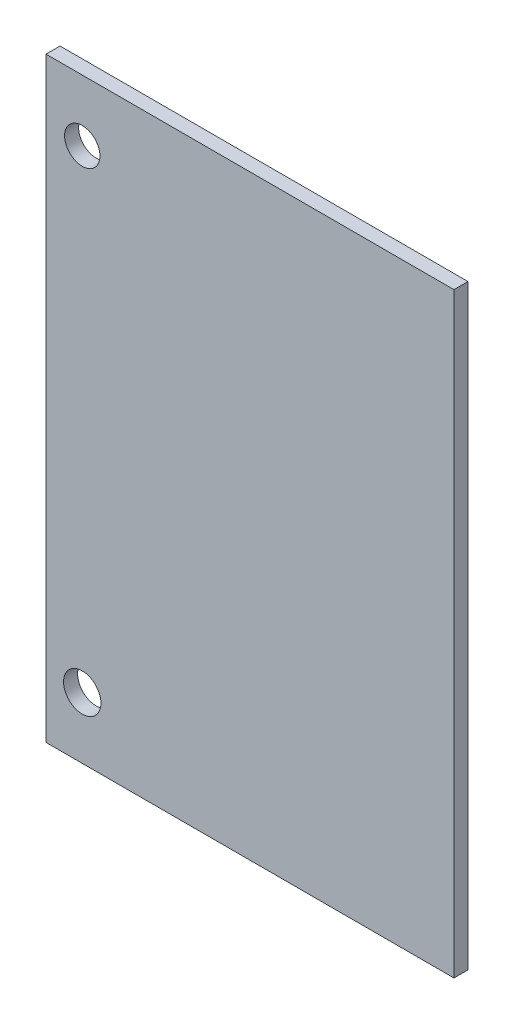
ISO-10303-21;
HEADER;
FILE_DESCRIPTION(('STEP AP214'),'2;1');
FILE_NAME('part.step','',(''),(''),'','','');
FILE_SCHEMA(('AUTOMOTIVE_DESIGN { 1 0 10303 214 1 1 1 1 }'));
ENDSEC;
DATA;
#1=APPLICATION_CONTEXT('core data for automotive mechanical design processes');
#2=APPLICATION_PROTOCOL_DEFINITION('international standard','automotive_design',2000,#1);
#3=PRODUCT_CONTEXT('',#1,'mechanical');
#4=PRODUCT('Part','Part','',(#3));
#5=PRODUCT_RELATED_PRODUCT_CATEGORY('part','',(#4));
#6=PRODUCT_DEFINITION_FORMATION('','',#4);
#7=PRODUCT_DEFINITION_CONTEXT('part definition',#1,'design');
#8=PRODUCT_DEFINITION('design','',#6,#7);
#9=PRODUCT_DEFINITION_SHAPE('','',#8);
#10=(LENGTH_UNIT() NAMED_UNIT(*) SI_UNIT(.MILLI.,.METRE.));
#11=(NAMED_UNIT(*) PLANE_ANGLE_UNIT() SI_UNIT($,.RADIAN.));
#12=(NAMED_UNIT(*) SI_UNIT($,.STERADIAN.) SOLID_ANGLE_UNIT());
#13=UNCERTAINTY_MEASURE_WITH_UNIT(LENGTH_MEASURE(1.E-05),#10,'distance_accuracy_value','');
#14=(GEOMETRIC_REPRESENTATION_CONTEXT(3) GLOBAL_UNCERTAINTY_ASSIGNED_CONTEXT((#13)) GLOBAL_UNIT_ASSIGNED_CONTEXT((#10,
#11,#12)) REPRESENTATION_CONTEXT('',''));
#15=CARTESIAN_POINT('',(0.,0.,0.));
#16=DIRECTION('',(0.,0.,1.));
#17=DIRECTION('',(1.,0.,0.));
#18=AXIS2_PLACEMENT_3D('',#15,#16,#17);
#19=CARTESIAN_POINT('',(0.,0.,1.2));
#20=DIRECTION('',(0.,0.,1.));
#21=DIRECTION('',(1.,0.,0.));
#22=AXIS2_PLACEMENT_3D('',#19,#20,#21);
#23=PLANE('',#22);
#24=DIRECTION('',(0.,-1.,0.));
#25=VECTOR('',#24,1.);
#26=CARTESIAN_POINT('',(-305.123327030624,35.7826153711837,1.2));
#27=LINE('',#26,#25);
#28=CARTESIAN_POINT('',(-305.123327030624,35.7826153711837,1.2));
#29=VERTEX_POINT('',#28);
#30=CARTESIAN_POINT('',(-305.123327030624,-15.2173846288163,1.2));
#31=VERTEX_POINT('',#30);
#32=EDGE_CURVE('E111',#29,#31,#27,.T.);
#33=ORIENTED_EDGE('',*,*,#32,.F.);
#34=DIRECTION('',(-1.,0.,0.));
#35=VECTOR('',#34,1.);
#36=CARTESIAN_POINT('',(-340.023327030624,35.7826153711837,1.2));
#37=LINE('',#36,#35);
#38=CARTESIAN_POINT('',(-340.023327030624,35.7826153711837,1.2));
#39=VERTEX_POINT('',#38);
#40=EDGE_CURVE('E57',#29,#39,#37,.T.);
#41=ORIENTED_EDGE('',*,*,#40,.T.);
#42=DIRECTION('',(0.,-1.,0.));
#43=VECTOR('',#42,1.);
#44=CARTESIAN_POINT('',(-340.023327030624,35.7826153711837,1.2));
#45=LINE('',#44,#43);
#46=CARTESIAN_POINT('',(-340.023327030624,-15.2173846288163,1.2));
#47=VERTEX_POINT('',#46);
#48=EDGE_CURVE('E77',#39,#47,#45,.T.);
#49=ORIENTED_EDGE('',*,*,#48,.T.);
#50=DIRECTION('',(1.,0.,0.));
#51=VECTOR('',#50,1.);
#52=CARTESIAN_POINT('',(-340.023327030624,-15.2173846288163,1.2));
#53=LINE('',#52,#51);
#54=EDGE_CURVE('E95',#47,#31,#53,.T.);
#55=ORIENTED_EDGE('',*,*,#54,.T.);
#56=EDGE_LOOP('',(#33,#41,#49,#55));
#57=FACE_BOUND('',#56,.T.);
#58=CARTESIAN_POINT('',(-336.923327030624,30.5326153711837,1.2));
#59=DIRECTION('',(0.,0.,1.));
#60=DIRECTION('',(1.,0.,0.));
#61=AXIS2_PLACEMENT_3D('',#58,#59,#60);
#62=CIRCLE('',#61,1.51211917062415);
#63=CARTESIAN_POINT('',(-335.411207859999,30.5326153711837,1.2));
#64=VERTEX_POINT('',#63);
#65=EDGE_CURVE('E87',#64,#64,#62,.T.);
#66=ORIENTED_EDGE('',*,*,#65,.F.);
#67=EDGE_LOOP('',(#66));
#68=FACE_BOUND('',#67,.T.);
#69=CARTESIAN_POINT('',(-336.923327030624,-9.96738462881631,1.2));
#70=DIRECTION('',(0.,0.,1.));
#71=DIRECTION('',(1.,0.,0.));
#72=AXIS2_PLACEMENT_3D('',#69,#70,#71);
#73=CIRCLE('',#72,1.59999999999996);
#74=CARTESIAN_POINT('',(-335.323327030624,-9.96738462881631,1.2));
#75=VERTEX_POINT('',#74);
#76=EDGE_CURVE('E100',#75,#75,#73,.T.);
#77=ORIENTED_EDGE('',*,*,#76,.F.);
#78=EDGE_LOOP('',(#77));
#79=FACE_BOUND('',#78,.T.);
#80=ADVANCED_FACE('F33',(#57,#68,#79),#23,.T.);
#81=CARTESIAN_POINT('',(0.,0.,0.));
#82=DIRECTION('',(0.,0.,1.));
#83=DIRECTION('',(1.,0.,0.));
#84=AXIS2_PLACEMENT_3D('',#81,#82,#83);
#85=PLANE('',#84);
#86=DIRECTION('',(-1.,0.,0.));
#87=VECTOR('',#86,1.);
#88=CARTESIAN_POINT('',(-340.023327030624,35.7826153711837,0.));
#89=LINE('',#88,#87);
#90=CARTESIAN_POINT('',(-305.123327030623,35.7826153711837,0.));
#91=VERTEX_POINT('',#90);
#92=CARTESIAN_POINT('',(-340.023327030624,35.7826153711837,0.));
#93=VERTEX_POINT('',#92);
#94=EDGE_CURVE('E70',#91,#93,#89,.T.);
#95=ORIENTED_EDGE('',*,*,#94,.F.);
#96=DIRECTION('',(0.,-1.,0.));
#97=VECTOR('',#96,1.);
#98=CARTESIAN_POINT('',(-305.123327030624,35.7826153711837,0.));
#99=LINE('',#98,#97);
#100=CARTESIAN_POINT('',(-305.123327030624,-15.2173846288163,0.));
#101=VERTEX_POINT('',#100);
#102=EDGE_CURVE('E48',#91,#101,#99,.T.);
#103=ORIENTED_EDGE('',*,*,#102,.T.);
#104=DIRECTION('',(1.,0.,0.));
#105=VECTOR('',#104,1.);
#106=CARTESIAN_POINT('',(-340.023327030624,-15.2173846288163,0.));
#107=LINE('',#106,#105);
#108=CARTESIAN_POINT('',(-340.023327030624,-15.2173846288163,0.));
#109=VERTEX_POINT('',#108);
#110=EDGE_CURVE('E78',#109,#101,#107,.T.);
#111=ORIENTED_EDGE('',*,*,#110,.F.);
#112=DIRECTION('',(0.,-1.,0.));
#113=VECTOR('',#112,1.);
#114=CARTESIAN_POINT('',(-340.023327030624,35.7826153711837,0.));
#115=LINE('',#114,#113);
#116=EDGE_CURVE('E83',#93,#109,#115,.T.);
#117=ORIENTED_EDGE('',*,*,#116,.F.);
#118=EDGE_LOOP('',(#95,#103,#111,#117));
#119=FACE_BOUND('',#118,.T.);
#120=CARTESIAN_POINT('',(-336.923327030624,30.5326153711837,0.));
#121=DIRECTION('',(0.,0.,1.));
#122=DIRECTION('',(1.,0.,0.));
#123=AXIS2_PLACEMENT_3D('',#120,#121,#122);
#124=CIRCLE('',#123,1.51211917062415);
#125=CARTESIAN_POINT('',(-335.411207859999,30.5326153711837,0.));
#126=VERTEX_POINT('',#125);
#127=EDGE_CURVE('E91',#126,#126,#124,.T.);
#128=ORIENTED_EDGE('',*,*,#127,.T.);
#129=EDGE_LOOP('',(#128));
#130=FACE_BOUND('',#129,.T.);
#131=CARTESIAN_POINT('',(-336.923327030624,-9.96738462881631,0.));
#132=DIRECTION('',(0.,0.,1.));
#133=DIRECTION('',(1.,0.,0.));
#134=AXIS2_PLACEMENT_3D('',#131,#132,#133);
#135=CIRCLE('',#134,1.59999999999996);
#136=CARTESIAN_POINT('',(-335.323327030624,-9.96738462881631,0.));
#137=VERTEX_POINT('',#136);
#138=EDGE_CURVE('E102',#137,#137,#135,.T.);
#139=ORIENTED_EDGE('',*,*,#138,.T.);
#140=EDGE_LOOP('',(#139));
#141=FACE_BOUND('',#140,.T.);
#142=ADVANCED_FACE('F84',(#119,#130,#141),#85,.F.);
#143=CARTESIAN_POINT('',(-340.023327030624,35.7826153711837,1.2));
#144=DIRECTION('',(1.,0.,0.));
#145=DIRECTION('',(0.,0.,-1.));
#146=AXIS2_PLACEMENT_3D('',#143,#144,#145);
#147=PLANE('',#146);
#148=ORIENTED_EDGE('',*,*,#116,.T.);
#149=DIRECTION('',(0.,0.,-1.));
#150=VECTOR('',#149,1.);
#151=CARTESIAN_POINT('',(-340.023327030624,-15.2173846288163,1.2));
#152=LINE('',#151,#150);
#153=EDGE_CURVE('E11',#47,#109,#152,.T.);
#154=ORIENTED_EDGE('',*,*,#153,.F.);
#155=ORIENTED_EDGE('',*,*,#48,.F.);
#156=DIRECTION('',(0.,0.,-1.));
#157=VECTOR('',#156,1.);
#158=CARTESIAN_POINT('',(-340.023327030624,35.7826153711837,1.2));
#159=LINE('',#158,#157);
#160=EDGE_CURVE('E41',#39,#93,#159,.T.);
#161=ORIENTED_EDGE('',*,*,#160,.T.);
#162=EDGE_LOOP('',(#148,#154,#155,#161));
#163=FACE_BOUND('',#162,.T.);
#164=ADVANCED_FACE('F35',(#163),#147,.F.);
#165=CARTESIAN_POINT('',(-340.023327030624,-15.2173846288163,1.2));
#166=DIRECTION('',(0.,1.,0.));
#167=DIRECTION('',(-1.,0.,0.));
#168=AXIS2_PLACEMENT_3D('',#165,#166,#167);
#169=PLANE('',#168);
#170=ORIENTED_EDGE('',*,*,#110,.T.);
#171=DIRECTION('',(0.,0.,1.));
#172=VECTOR('',#171,1.);
#173=CARTESIAN_POINT('',(-305.123327030624,-15.2173846288163,0.));
#174=LINE('',#173,#172);
#175=EDGE_CURVE('E107',#101,#31,#174,.T.);
#176=ORIENTED_EDGE('',*,*,#175,.T.);
#177=ORIENTED_EDGE('',*,*,#54,.F.);
#178=ORIENTED_EDGE('',*,*,#153,.T.);
#179=EDGE_LOOP('',(#170,#176,#177,#178));
#180=FACE_BOUND('',#179,.T.);
#181=ADVANCED_FACE('F117',(#180),#169,.F.);
#182=CARTESIAN_POINT('',(-340.023327030624,35.7826153711837,1.2));
#183=DIRECTION('',(0.,-1.,0.));
#184=DIRECTION('',(1.,0.,0.));
#185=AXIS2_PLACEMENT_3D('',#182,#183,#184);
#186=PLANE('',#185);
#187=ORIENTED_EDGE('',*,*,#40,.F.);
#188=DIRECTION('',(0.,0.,1.));
#189=VECTOR('',#188,1.);
#190=CARTESIAN_POINT('',(-305.123327030624,35.7826153711837,0.));
#191=LINE('',#190,#189);
#192=EDGE_CURVE('E74',#91,#29,#191,.T.);
#193=ORIENTED_EDGE('',*,*,#192,.F.);
#194=ORIENTED_EDGE('',*,*,#94,.T.);
#195=ORIENTED_EDGE('',*,*,#160,.F.);
#196=EDGE_LOOP('',(#187,#193,#194,#195));
#197=FACE_BOUND('',#196,.T.);
#198=ADVANCED_FACE('F72',(#197),#186,.F.);
#199=CARTESIAN_POINT('',(-336.923327030624,30.5326153711837,1.2));
#200=DIRECTION('',(0.,0.,-1.));
#201=DIRECTION('',(-1.,0.,0.));
#202=AXIS2_PLACEMENT_3D('',#199,#200,#201);
#203=CYLINDRICAL_SURFACE('',#202,1.51211917062415);
#204=ORIENTED_EDGE('',*,*,#65,.T.);
#205=EDGE_LOOP('',(#204));
#206=FACE_BOUND('',#205,.T.);
#207=ORIENTED_EDGE('',*,*,#127,.F.);
#208=EDGE_LOOP('',(#207));
#209=FACE_BOUND('',#208,.T.);
#210=ADVANCED_FACE('F130',(#206,#209),#203,.F.);
#211=CARTESIAN_POINT('',(-336.923327030624,-9.96738462881631,1.2));
#212=DIRECTION('',(0.,0.,-1.));
#213=DIRECTION('',(-1.,0.,0.));
#214=AXIS2_PLACEMENT_3D('',#211,#212,#213);
#215=CYLINDRICAL_SURFACE('',#214,1.59999999999996);
#216=ORIENTED_EDGE('',*,*,#76,.T.);
#217=EDGE_LOOP('',(#216));
#218=FACE_BOUND('',#217,.T.);
#219=ORIENTED_EDGE('',*,*,#138,.F.);
#220=EDGE_LOOP('',(#219));
#221=FACE_BOUND('',#220,.T.);
#222=ADVANCED_FACE('F126',(#218,#221),#215,.F.);
#223=CARTESIAN_POINT('',(-305.123327030624,35.7826153711837,0.));
#224=DIRECTION('',(-1.,0.,0.));
#225=DIRECTION('',(0.,0.,1.));
#226=AXIS2_PLACEMENT_3D('',#223,#224,#225);
#227=PLANE('',#226);
#228=ORIENTED_EDGE('',*,*,#32,.T.);
#229=ORIENTED_EDGE('',*,*,#175,.F.);
#230=ORIENTED_EDGE('',*,*,#102,.F.);
#231=ORIENTED_EDGE('',*,*,#192,.T.);
#232=EDGE_LOOP('',(#228,#229,#230,#231));
#233=FACE_BOUND('',#232,.T.);
#234=ADVANCED_FACE('F129',(#233),#227,.F.);
#235=CLOSED_SHELL('',(#80,#142,#164,#181,#198,#210,#222,#234));
#236=MANIFOLD_SOLID_BREP('B2',#235);
#237=ADVANCED_BREP_SHAPE_REPRESENTATION('',(#18,#236),#14);
#238=SHAPE_DEFINITION_REPRESENTATION(#9,#237);
ENDSEC;
END-ISO-10303-21;
